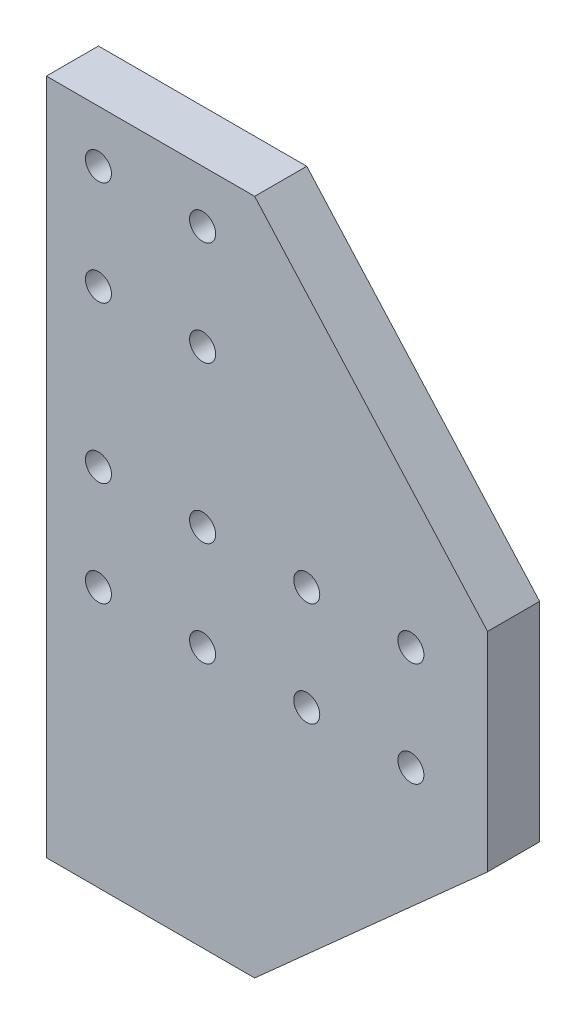
ISO-10303-21;
HEADER;
FILE_DESCRIPTION(('STEP AP214'),'2;1');
FILE_NAME('part.step','',(''),(''),'','','');
FILE_SCHEMA(('AUTOMOTIVE_DESIGN { 1 0 10303 214 1 1 1 1 }'));
ENDSEC;
DATA;
#1=APPLICATION_CONTEXT('core data for automotive mechanical design processes');
#2=APPLICATION_PROTOCOL_DEFINITION('international standard','automotive_design',2000,#1);
#3=PRODUCT_CONTEXT('',#1,'mechanical');
#4=PRODUCT('Part','Part','',(#3));
#5=PRODUCT_RELATED_PRODUCT_CATEGORY('part','',(#4));
#6=PRODUCT_DEFINITION_FORMATION('','',#4);
#7=PRODUCT_DEFINITION_CONTEXT('part definition',#1,'design');
#8=PRODUCT_DEFINITION('design','',#6,#7);
#9=PRODUCT_DEFINITION_SHAPE('','',#8);
#10=(LENGTH_UNIT() NAMED_UNIT(*) SI_UNIT(.MILLI.,.METRE.));
#11=(NAMED_UNIT(*) PLANE_ANGLE_UNIT() SI_UNIT($,.RADIAN.));
#12=(NAMED_UNIT(*) SI_UNIT($,.STERADIAN.) SOLID_ANGLE_UNIT());
#13=UNCERTAINTY_MEASURE_WITH_UNIT(LENGTH_MEASURE(1.E-05),#10,'distance_accuracy_value','');
#14=(GEOMETRIC_REPRESENTATION_CONTEXT(3) GLOBAL_UNCERTAINTY_ASSIGNED_CONTEXT((#13)) GLOBAL_UNIT_ASSIGNED_CONTEXT((#10,
#11,#12)) REPRESENTATION_CONTEXT('',''));
#15=CARTESIAN_POINT('',(0.,0.,0.));
#16=DIRECTION('',(0.,0.,1.));
#17=DIRECTION('',(1.,0.,0.));
#18=AXIS2_PLACEMENT_3D('',#15,#16,#17);
#19=CARTESIAN_POINT('',(0.,130.,10.));
#20=DIRECTION('',(1.,0.,0.));
#21=DIRECTION('',(0.,0.,-1.));
#22=AXIS2_PLACEMENT_3D('',#19,#20,#21);
#23=PLANE('',#22);
#24=DIRECTION('',(0.,-1.,0.));
#25=VECTOR('',#24,1.);
#26=CARTESIAN_POINT('',(0.,130.,0.));
#27=LINE('',#26,#25);
#28=CARTESIAN_POINT('',(0.,130.,0.));
#29=VERTEX_POINT('',#28);
#30=CARTESIAN_POINT('',(0.,0.,0.));
#31=VERTEX_POINT('',#30);
#32=EDGE_CURVE('E132',#29,#31,#27,.T.);
#33=ORIENTED_EDGE('',*,*,#32,.T.);
#34=DIRECTION('',(0.,0.,-1.));
#35=VECTOR('',#34,1.);
#36=CARTESIAN_POINT('',(0.,0.,10.));
#37=LINE('',#36,#35);
#38=CARTESIAN_POINT('',(0.,0.,10.));
#39=VERTEX_POINT('',#38);
#40=EDGE_CURVE('E11',#39,#31,#37,.T.);
#41=ORIENTED_EDGE('',*,*,#40,.F.);
#42=DIRECTION('',(0.,-1.,0.));
#43=VECTOR('',#42,1.);
#44=CARTESIAN_POINT('',(0.,130.,10.));
#45=LINE('',#44,#43);
#46=CARTESIAN_POINT('',(0.,130.,10.));
#47=VERTEX_POINT('',#46);
#48=EDGE_CURVE('E149',#47,#39,#45,.T.);
#49=ORIENTED_EDGE('',*,*,#48,.F.);
#50=DIRECTION('',(0.,0.,-1.));
#51=VECTOR('',#50,1.);
#52=CARTESIAN_POINT('',(0.,130.,10.));
#53=LINE('',#52,#51);
#54=EDGE_CURVE('E128',#47,#29,#53,.T.);
#55=ORIENTED_EDGE('',*,*,#54,.T.);
#56=EDGE_LOOP('',(#33,#41,#49,#55));
#57=FACE_BOUND('',#56,.T.);
#58=ADVANCED_FACE('F43',(#57),#23,.F.);
#59=CARTESIAN_POINT('',(0.,0.,10.));
#60=DIRECTION('',(0.,1.,0.));
#61=DIRECTION('',(0.,0.,1.));
#62=AXIS2_PLACEMENT_3D('',#59,#60,#61);
#63=PLANE('',#62);
#64=DIRECTION('',(1.,0.,0.));
#65=VECTOR('',#64,1.);
#66=CARTESIAN_POINT('',(0.,0.,0.));
#67=LINE('',#66,#65);
#68=CARTESIAN_POINT('',(40.,0.,0.));
#69=VERTEX_POINT('',#68);
#70=EDGE_CURVE('E136',#31,#69,#67,.T.);
#71=ORIENTED_EDGE('',*,*,#70,.T.);
#72=DIRECTION('',(0.,0.,-1.));
#73=VECTOR('',#72,1.);
#74=CARTESIAN_POINT('',(40.,0.,10.));
#75=LINE('',#74,#73);
#76=CARTESIAN_POINT('',(40.,0.,10.));
#77=VERTEX_POINT('',#76);
#78=EDGE_CURVE('E52',#77,#69,#75,.T.);
#79=ORIENTED_EDGE('',*,*,#78,.F.);
#80=DIRECTION('',(1.,0.,0.));
#81=VECTOR('',#80,1.);
#82=CARTESIAN_POINT('',(0.,0.,10.));
#83=LINE('',#82,#81);
#84=EDGE_CURVE('E97',#39,#77,#83,.T.);
#85=ORIENTED_EDGE('',*,*,#84,.F.);
#86=ORIENTED_EDGE('',*,*,#40,.T.);
#87=EDGE_LOOP('',(#71,#79,#85,#86));
#88=FACE_BOUND('',#87,.T.);
#89=ADVANCED_FACE('F178',(#88),#63,.F.);
#90=CARTESIAN_POINT('',(40.,0.,10.));
#91=DIRECTION('',(-0.666666666666667,0.74535599249993,0.));
#92=DIRECTION('',(-0.74535599249993,-0.666666666666667,0.));
#93=AXIS2_PLACEMENT_3D('',#90,#91,#92);
#94=PLANE('',#93);
#95=DIRECTION('',(0.74535599249993,0.666666666666667,0.));
#96=VECTOR('',#95,1.);
#97=CARTESIAN_POINT('',(40.,0.,0.));
#98=LINE('',#97,#96);
#99=CARTESIAN_POINT('',(84.7213595499958,40.,0.));
#100=VERTEX_POINT('',#99);
#101=EDGE_CURVE('E140',#69,#100,#98,.T.);
#102=ORIENTED_EDGE('',*,*,#101,.T.);
#103=DIRECTION('',(0.,0.,-1.));
#104=VECTOR('',#103,1.);
#105=CARTESIAN_POINT('',(84.7213595499958,40.,10.));
#106=LINE('',#105,#104);
#107=CARTESIAN_POINT('',(84.7213595499958,40.,10.));
#108=VERTEX_POINT('',#107);
#109=EDGE_CURVE('E121',#108,#100,#106,.T.);
#110=ORIENTED_EDGE('',*,*,#109,.F.);
#111=DIRECTION('',(0.74535599249993,0.666666666666667,0.));
#112=VECTOR('',#111,1.);
#113=CARTESIAN_POINT('',(40.,0.,10.));
#114=LINE('',#113,#112);
#115=EDGE_CURVE('E110',#77,#108,#114,.T.);
#116=ORIENTED_EDGE('',*,*,#115,.F.);
#117=ORIENTED_EDGE('',*,*,#78,.T.);
#118=EDGE_LOOP('',(#102,#110,#116,#117));
#119=FACE_BOUND('',#118,.T.);
#120=ADVANCED_FACE('F159',(#119),#94,.F.);
#121=CARTESIAN_POINT('',(84.7213595499958,40.,10.));
#122=DIRECTION('',(-1.,0.,0.));
#123=DIRECTION('',(0.,0.,1.));
#124=AXIS2_PLACEMENT_3D('',#121,#122,#123);
#125=PLANE('',#124);
#126=DIRECTION('',(0.,1.,0.));
#127=VECTOR('',#126,1.);
#128=CARTESIAN_POINT('',(84.7213595499958,40.,0.));
#129=LINE('',#128,#127);
#130=CARTESIAN_POINT('',(84.7213595499958,80.,0.));
#131=VERTEX_POINT('',#130);
#132=EDGE_CURVE('E119',#100,#131,#129,.T.);
#133=ORIENTED_EDGE('',*,*,#132,.T.);
#134=DIRECTION('',(0.,0.,-1.));
#135=VECTOR('',#134,1.);
#136=CARTESIAN_POINT('',(84.7213595499958,80.,10.));
#137=LINE('',#136,#135);
#138=CARTESIAN_POINT('',(84.7213595499958,80.,10.));
#139=VERTEX_POINT('',#138);
#140=EDGE_CURVE('E116',#139,#131,#137,.T.);
#141=ORIENTED_EDGE('',*,*,#140,.F.);
#142=DIRECTION('',(0.,1.,0.));
#143=VECTOR('',#142,1.);
#144=CARTESIAN_POINT('',(84.7213595499958,40.,10.));
#145=LINE('',#144,#143);
#146=EDGE_CURVE('E104',#108,#139,#145,.T.);
#147=ORIENTED_EDGE('',*,*,#146,.F.);
#148=ORIENTED_EDGE('',*,*,#109,.T.);
#149=EDGE_LOOP('',(#133,#141,#147,#148));
#150=FACE_BOUND('',#149,.T.);
#151=ADVANCED_FACE('F117',(#150),#125,.F.);
#152=CARTESIAN_POINT('',(84.7213595499958,80.,10.));
#153=DIRECTION('',(-0.74535599249993,-0.666666666666667,0.));
#154=DIRECTION('',(0.666666666666667,-0.74535599249993,0.));
#155=AXIS2_PLACEMENT_3D('',#152,#153,#154);
#156=PLANE('',#155);
#157=DIRECTION('',(-0.666666666666667,0.74535599249993,0.));
#158=VECTOR('',#157,1.);
#159=CARTESIAN_POINT('',(84.7213595499958,80.,0.));
#160=LINE('',#159,#158);
#161=CARTESIAN_POINT('',(40.,130.,0.));
#162=VERTEX_POINT('',#161);
#163=EDGE_CURVE('E83',#131,#162,#160,.T.);
#164=ORIENTED_EDGE('',*,*,#163,.T.);
#165=DIRECTION('',(0.,0.,-1.));
#166=VECTOR('',#165,1.);
#167=CARTESIAN_POINT('',(40.,130.,10.));
#168=LINE('',#167,#166);
#169=CARTESIAN_POINT('',(40.,130.,10.));
#170=VERTEX_POINT('',#169);
#171=EDGE_CURVE('E122',#170,#162,#168,.T.);
#172=ORIENTED_EDGE('',*,*,#171,.F.);
#173=DIRECTION('',(-0.666666666666667,0.74535599249993,0.));
#174=VECTOR('',#173,1.);
#175=CARTESIAN_POINT('',(84.7213595499958,80.,10.));
#176=LINE('',#175,#174);
#177=EDGE_CURVE('E108',#139,#170,#176,.T.);
#178=ORIENTED_EDGE('',*,*,#177,.F.);
#179=ORIENTED_EDGE('',*,*,#140,.T.);
#180=EDGE_LOOP('',(#164,#172,#178,#179));
#181=FACE_BOUND('',#180,.T.);
#182=ADVANCED_FACE('F124',(#181),#156,.F.);
#183=CARTESIAN_POINT('',(40.,130.,10.));
#184=DIRECTION('',(0.,-1.,0.));
#185=DIRECTION('',(0.,0.,-1.));
#186=AXIS2_PLACEMENT_3D('',#183,#184,#185);
#187=PLANE('',#186);
#188=DIRECTION('',(-1.,0.,0.));
#189=VECTOR('',#188,1.);
#190=CARTESIAN_POINT('',(40.,130.,0.));
#191=LINE('',#190,#189);
#192=EDGE_CURVE('E89',#162,#29,#191,.T.);
#193=ORIENTED_EDGE('',*,*,#192,.T.);
#194=ORIENTED_EDGE('',*,*,#54,.F.);
#195=DIRECTION('',(-1.,0.,0.));
#196=VECTOR('',#195,1.);
#197=CARTESIAN_POINT('',(40.,130.,10.));
#198=LINE('',#197,#196);
#199=EDGE_CURVE('E60',#170,#47,#198,.T.);
#200=ORIENTED_EDGE('',*,*,#199,.F.);
#201=ORIENTED_EDGE('',*,*,#171,.T.);
#202=EDGE_LOOP('',(#193,#194,#200,#201));
#203=FACE_BOUND('',#202,.T.);
#204=ADVANCED_FACE('F166',(#203),#187,.F.);
#205=CARTESIAN_POINT('',(0.,0.,10.));
#206=DIRECTION('',(0.,0.,1.));
#207=DIRECTION('',(1.,0.,0.));
#208=AXIS2_PLACEMENT_3D('',#205,#206,#207);
#209=PLANE('',#208);
#210=CARTESIAN_POINT('',(30.,70.,10.));
#211=DIRECTION('',(0.,0.,1.));
#212=DIRECTION('',(1.,0.,0.));
#213=AXIS2_PLACEMENT_3D('',#210,#211,#212);
#214=CIRCLE('',#213,2.50000000000001);
#215=CARTESIAN_POINT('',(32.5,70.,10.));
#216=VERTEX_POINT('',#215);
#217=EDGE_CURVE('E398',#216,#216,#214,.T.);
#218=ORIENTED_EDGE('',*,*,#217,.F.);
#219=EDGE_LOOP('',(#218));
#220=FACE_BOUND('',#219,.T.);
#221=CARTESIAN_POINT('',(10.,50.,10.));
#222=DIRECTION('',(0.,0.,1.));
#223=DIRECTION('',(1.,0.,0.));
#224=AXIS2_PLACEMENT_3D('',#221,#222,#223);
#225=CIRCLE('',#224,2.5);
#226=CARTESIAN_POINT('',(12.5,50.,10.));
#227=VERTEX_POINT('',#226);
#228=EDGE_CURVE('E407',#227,#227,#225,.T.);
#229=ORIENTED_EDGE('',*,*,#228,.F.);
#230=EDGE_LOOP('',(#229));
#231=FACE_BOUND('',#230,.T.);
#232=CARTESIAN_POINT('',(30.,50.,10.));
#233=DIRECTION('',(0.,0.,1.));
#234=DIRECTION('',(1.,0.,0.));
#235=AXIS2_PLACEMENT_3D('',#232,#233,#234);
#236=CIRCLE('',#235,2.50000000000001);
#237=CARTESIAN_POINT('',(32.5,50.,10.));
#238=VERTEX_POINT('',#237);
#239=EDGE_CURVE('E420',#238,#238,#236,.T.);
#240=ORIENTED_EDGE('',*,*,#239,.F.);
#241=EDGE_LOOP('',(#240));
#242=FACE_BOUND('',#241,.T.);
#243=CARTESIAN_POINT('',(50.,70.,10.));
#244=DIRECTION('',(0.,0.,1.));
#245=DIRECTION('',(1.,0.,0.));
#246=AXIS2_PLACEMENT_3D('',#243,#244,#245);
#247=CIRCLE('',#246,2.5);
#248=CARTESIAN_POINT('',(52.5,70.,10.));
#249=VERTEX_POINT('',#248);
#250=EDGE_CURVE('E493',#249,#249,#247,.T.);
#251=ORIENTED_EDGE('',*,*,#250,.F.);
#252=EDGE_LOOP('',(#251));
#253=FACE_BOUND('',#252,.T.);
#254=CARTESIAN_POINT('',(30.,120.,10.));
#255=DIRECTION('',(0.,0.,1.));
#256=DIRECTION('',(1.,0.,0.));
#257=AXIS2_PLACEMENT_3D('',#254,#255,#256);
#258=CIRCLE('',#257,2.50000000000001);
#259=CARTESIAN_POINT('',(32.5,120.,10.));
#260=VERTEX_POINT('',#259);
#261=EDGE_CURVE('E433',#260,#260,#258,.T.);
#262=ORIENTED_EDGE('',*,*,#261,.F.);
#263=EDGE_LOOP('',(#262));
#264=FACE_BOUND('',#263,.T.);
#265=CARTESIAN_POINT('',(10.,100.,10.));
#266=DIRECTION('',(0.,0.,1.));
#267=DIRECTION('',(1.,0.,0.));
#268=AXIS2_PLACEMENT_3D('',#265,#266,#267);
#269=CIRCLE('',#268,2.5);
#270=CARTESIAN_POINT('',(12.5,100.,10.));
#271=VERTEX_POINT('',#270);
#272=EDGE_CURVE('E442',#271,#271,#269,.T.);
#273=ORIENTED_EDGE('',*,*,#272,.F.);
#274=EDGE_LOOP('',(#273));
#275=FACE_BOUND('',#274,.T.);
#276=CARTESIAN_POINT('',(30.,100.,10.));
#277=DIRECTION('',(0.,0.,1.));
#278=DIRECTION('',(1.,0.,0.));
#279=AXIS2_PLACEMENT_3D('',#276,#277,#278);
#280=CIRCLE('',#279,2.50000000000001);
#281=CARTESIAN_POINT('',(32.5,100.,10.));
#282=VERTEX_POINT('',#281);
#283=EDGE_CURVE('E421',#282,#282,#280,.T.);
#284=ORIENTED_EDGE('',*,*,#283,.F.);
#285=EDGE_LOOP('',(#284));
#286=FACE_BOUND('',#285,.T.);
#287=CARTESIAN_POINT('',(10.,70.,10.));
#288=DIRECTION('',(0.,0.,1.));
#289=DIRECTION('',(1.,0.,0.));
#290=AXIS2_PLACEMENT_3D('',#287,#288,#289);
#291=CIRCLE('',#290,2.5);
#292=CARTESIAN_POINT('',(12.5,70.,10.));
#293=VERTEX_POINT('',#292);
#294=EDGE_CURVE('E405',#293,#293,#291,.T.);
#295=ORIENTED_EDGE('',*,*,#294,.F.);
#296=EDGE_LOOP('',(#295));
#297=FACE_BOUND('',#296,.T.);
#298=CARTESIAN_POINT('',(70.,50.,10.));
#299=DIRECTION('',(0.,0.,1.));
#300=DIRECTION('',(1.,0.,0.));
#301=AXIS2_PLACEMENT_3D('',#298,#299,#300);
#302=CIRCLE('',#301,2.5);
#303=CARTESIAN_POINT('',(72.5,50.,10.));
#304=VERTEX_POINT('',#303);
#305=EDGE_CURVE('E478',#304,#304,#302,.T.);
#306=ORIENTED_EDGE('',*,*,#305,.F.);
#307=EDGE_LOOP('',(#306));
#308=FACE_BOUND('',#307,.T.);
#309=CARTESIAN_POINT('',(50.,50.,10.));
#310=DIRECTION('',(0.,0.,1.));
#311=DIRECTION('',(1.,0.,0.));
#312=AXIS2_PLACEMENT_3D('',#309,#310,#311);
#313=CIRCLE('',#312,2.5);
#314=CARTESIAN_POINT('',(52.5,50.,10.));
#315=VERTEX_POINT('',#314);
#316=EDGE_CURVE('E482',#315,#315,#313,.T.);
#317=ORIENTED_EDGE('',*,*,#316,.F.);
#318=EDGE_LOOP('',(#317));
#319=FACE_BOUND('',#318,.T.);
#320=CARTESIAN_POINT('',(70.,70.,10.));
#321=DIRECTION('',(0.,0.,1.));
#322=DIRECTION('',(1.,0.,0.));
#323=AXIS2_PLACEMENT_3D('',#320,#321,#322);
#324=CIRCLE('',#323,2.5);
#325=CARTESIAN_POINT('',(72.5,70.,10.));
#326=VERTEX_POINT('',#325);
#327=EDGE_CURVE('E485',#326,#326,#324,.T.);
#328=ORIENTED_EDGE('',*,*,#327,.F.);
#329=EDGE_LOOP('',(#328));
#330=FACE_BOUND('',#329,.T.);
#331=CARTESIAN_POINT('',(10.,120.,10.));
#332=DIRECTION('',(0.,0.,1.));
#333=DIRECTION('',(1.,0.,0.));
#334=AXIS2_PLACEMENT_3D('',#331,#332,#333);
#335=CIRCLE('',#334,2.5);
#336=CARTESIAN_POINT('',(12.5,120.,10.));
#337=VERTEX_POINT('',#336);
#338=EDGE_CURVE('E437',#337,#337,#335,.T.);
#339=ORIENTED_EDGE('',*,*,#338,.F.);
#340=EDGE_LOOP('',(#339));
#341=FACE_BOUND('',#340,.T.);
#342=ORIENTED_EDGE('',*,*,#48,.T.);
#343=ORIENTED_EDGE('',*,*,#84,.T.);
#344=ORIENTED_EDGE('',*,*,#115,.T.);
#345=ORIENTED_EDGE('',*,*,#146,.T.);
#346=ORIENTED_EDGE('',*,*,#177,.T.);
#347=ORIENTED_EDGE('',*,*,#199,.T.);
#348=EDGE_LOOP('',(#342,#343,#344,#345,#346,#347));
#349=FACE_BOUND('',#348,.T.);
#350=ADVANCED_FACE('F106',(#220,#231,#242,#253,#264,#275,#286,#297,#308,#319,#330,#341,#349),
#209,.T.);
#351=CARTESIAN_POINT('',(0.,0.,0.));
#352=DIRECTION('',(0.,0.,1.));
#353=DIRECTION('',(1.,0.,0.));
#354=AXIS2_PLACEMENT_3D('',#351,#352,#353);
#355=PLANE('',#354);
#356=CARTESIAN_POINT('',(30.,70.,0.));
#357=DIRECTION('',(0.,0.,1.));
#358=DIRECTION('',(1.,0.,0.));
#359=AXIS2_PLACEMENT_3D('',#356,#357,#358);
#360=CIRCLE('',#359,2.50000000000001);
#361=CARTESIAN_POINT('',(32.5,70.,0.));
#362=VERTEX_POINT('',#361);
#363=EDGE_CURVE('E395',#362,#362,#360,.T.);
#364=ORIENTED_EDGE('',*,*,#363,.T.);
#365=EDGE_LOOP('',(#364));
#366=FACE_BOUND('',#365,.T.);
#367=CARTESIAN_POINT('',(10.,50.,0.));
#368=DIRECTION('',(0.,0.,1.));
#369=DIRECTION('',(1.,0.,0.));
#370=AXIS2_PLACEMENT_3D('',#367,#368,#369);
#371=CIRCLE('',#370,2.5);
#372=CARTESIAN_POINT('',(12.5,50.,0.));
#373=VERTEX_POINT('',#372);
#374=EDGE_CURVE('E416',#373,#373,#371,.T.);
#375=ORIENTED_EDGE('',*,*,#374,.T.);
#376=EDGE_LOOP('',(#375));
#377=FACE_BOUND('',#376,.T.);
#378=CARTESIAN_POINT('',(30.,50.,0.));
#379=DIRECTION('',(0.,0.,1.));
#380=DIRECTION('',(1.,0.,0.));
#381=AXIS2_PLACEMENT_3D('',#378,#379,#380);
#382=CIRCLE('',#381,2.50000000000001);
#383=CARTESIAN_POINT('',(32.5,50.,0.));
#384=VERTEX_POINT('',#383);
#385=EDGE_CURVE('E509',#384,#384,#382,.T.);
#386=ORIENTED_EDGE('',*,*,#385,.T.);
#387=EDGE_LOOP('',(#386));
#388=FACE_BOUND('',#387,.T.);
#389=CARTESIAN_POINT('',(50.,70.,0.));
#390=DIRECTION('',(0.,0.,1.));
#391=DIRECTION('',(1.,0.,0.));
#392=AXIS2_PLACEMENT_3D('',#389,#390,#391);
#393=CIRCLE('',#392,2.5);
#394=CARTESIAN_POINT('',(52.5,70.,0.));
#395=VERTEX_POINT('',#394);
#396=EDGE_CURVE('E410',#395,#395,#393,.T.);
#397=ORIENTED_EDGE('',*,*,#396,.T.);
#398=EDGE_LOOP('',(#397));
#399=FACE_BOUND('',#398,.T.);
#400=CARTESIAN_POINT('',(30.,120.,0.));
#401=DIRECTION('',(0.,0.,1.));
#402=DIRECTION('',(1.,0.,0.));
#403=AXIS2_PLACEMENT_3D('',#400,#401,#402);
#404=CIRCLE('',#403,2.50000000000001);
#405=CARTESIAN_POINT('',(32.5,120.,0.));
#406=VERTEX_POINT('',#405);
#407=EDGE_CURVE('E438',#406,#406,#404,.T.);
#408=ORIENTED_EDGE('',*,*,#407,.T.);
#409=EDGE_LOOP('',(#408));
#410=FACE_BOUND('',#409,.T.);
#411=CARTESIAN_POINT('',(10.,100.,0.));
#412=DIRECTION('',(0.,0.,1.));
#413=DIRECTION('',(1.,0.,0.));
#414=AXIS2_PLACEMENT_3D('',#411,#412,#413);
#415=CIRCLE('',#414,2.5);
#416=CARTESIAN_POINT('',(12.5,100.,0.));
#417=VERTEX_POINT('',#416);
#418=EDGE_CURVE('E425',#417,#417,#415,.T.);
#419=ORIENTED_EDGE('',*,*,#418,.T.);
#420=EDGE_LOOP('',(#419));
#421=FACE_BOUND('',#420,.T.);
#422=CARTESIAN_POINT('',(30.,100.,0.));
#423=DIRECTION('',(0.,0.,1.));
#424=DIRECTION('',(1.,0.,0.));
#425=AXIS2_PLACEMENT_3D('',#422,#423,#424);
#426=CIRCLE('',#425,2.50000000000001);
#427=CARTESIAN_POINT('',(32.5,100.,0.));
#428=VERTEX_POINT('',#427);
#429=EDGE_CURVE('E426',#428,#428,#426,.T.);
#430=ORIENTED_EDGE('',*,*,#429,.T.);
#431=EDGE_LOOP('',(#430));
#432=FACE_BOUND('',#431,.T.);
#433=CARTESIAN_POINT('',(10.,70.,0.));
#434=DIRECTION('',(0.,0.,1.));
#435=DIRECTION('',(1.,0.,0.));
#436=AXIS2_PLACEMENT_3D('',#433,#434,#435);
#437=CIRCLE('',#436,2.5);
#438=CARTESIAN_POINT('',(12.5,70.,0.));
#439=VERTEX_POINT('',#438);
#440=EDGE_CURVE('E400',#439,#439,#437,.T.);
#441=ORIENTED_EDGE('',*,*,#440,.T.);
#442=EDGE_LOOP('',(#441));
#443=FACE_BOUND('',#442,.T.);
#444=CARTESIAN_POINT('',(70.,50.,0.));
#445=DIRECTION('',(0.,0.,1.));
#446=DIRECTION('',(1.,0.,0.));
#447=AXIS2_PLACEMENT_3D('',#444,#445,#446);
#448=CIRCLE('',#447,2.5);
#449=CARTESIAN_POINT('',(72.5,50.,0.));
#450=VERTEX_POINT('',#449);
#451=EDGE_CURVE('E497',#450,#450,#448,.T.);
#452=ORIENTED_EDGE('',*,*,#451,.T.);
#453=EDGE_LOOP('',(#452));
#454=FACE_BOUND('',#453,.T.);
#455=CARTESIAN_POINT('',(50.,50.,0.));
#456=DIRECTION('',(0.,0.,1.));
#457=DIRECTION('',(1.,0.,0.));
#458=AXIS2_PLACEMENT_3D('',#455,#456,#457);
#459=CIRCLE('',#458,2.5);
#460=CARTESIAN_POINT('',(52.5,50.,0.));
#461=VERTEX_POINT('',#460);
#462=EDGE_CURVE('E502',#461,#461,#459,.T.);
#463=ORIENTED_EDGE('',*,*,#462,.T.);
#464=EDGE_LOOP('',(#463));
#465=FACE_BOUND('',#464,.T.);
#466=CARTESIAN_POINT('',(70.,70.,0.));
#467=DIRECTION('',(0.,0.,1.));
#468=DIRECTION('',(1.,0.,0.));
#469=AXIS2_PLACEMENT_3D('',#466,#467,#468);
#470=CIRCLE('',#469,2.5);
#471=CARTESIAN_POINT('',(72.5,70.,0.));
#472=VERTEX_POINT('',#471);
#473=EDGE_CURVE('E488',#472,#472,#470,.T.);
#474=ORIENTED_EDGE('',*,*,#473,.T.);
#475=EDGE_LOOP('',(#474));
#476=FACE_BOUND('',#475,.T.);
#477=CARTESIAN_POINT('',(10.,120.,0.));
#478=DIRECTION('',(0.,0.,1.));
#479=DIRECTION('',(1.,0.,0.));
#480=AXIS2_PLACEMENT_3D('',#477,#478,#479);
#481=CIRCLE('',#480,2.5);
#482=CARTESIAN_POINT('',(12.5,120.,0.));
#483=VERTEX_POINT('',#482);
#484=EDGE_CURVE('E137',#483,#483,#481,.T.);
#485=ORIENTED_EDGE('',*,*,#484,.T.);
#486=EDGE_LOOP('',(#485));
#487=FACE_BOUND('',#486,.T.);
#488=ORIENTED_EDGE('',*,*,#32,.F.);
#489=ORIENTED_EDGE('',*,*,#192,.F.);
#490=ORIENTED_EDGE('',*,*,#163,.F.);
#491=ORIENTED_EDGE('',*,*,#132,.F.);
#492=ORIENTED_EDGE('',*,*,#101,.F.);
#493=ORIENTED_EDGE('',*,*,#70,.F.);
#494=EDGE_LOOP('',(#488,#489,#490,#491,#492,#493));
#495=FACE_BOUND('',#494,.T.);
#496=ADVANCED_FACE('F162',(#366,#377,#388,#399,#410,#421,#432,#443,#454,#465,#476,#487,#495),
#355,.F.);
#497=CARTESIAN_POINT('',(10.,120.,0.));
#498=DIRECTION('',(0.,0.,1.));
#499=DIRECTION('',(1.,0.,0.));
#500=AXIS2_PLACEMENT_3D('',#497,#498,#499);
#501=CYLINDRICAL_SURFACE('',#500,2.5);
#502=ORIENTED_EDGE('',*,*,#484,.F.);
#503=EDGE_LOOP('',(#502));
#504=FACE_BOUND('',#503,.T.);
#505=ORIENTED_EDGE('',*,*,#338,.T.);
#506=EDGE_LOOP('',(#505));
#507=FACE_BOUND('',#506,.T.);
#508=ADVANCED_FACE('F218',(#504,#507),#501,.F.);
#509=CARTESIAN_POINT('',(70.,70.,0.));
#510=DIRECTION('',(0.,0.,1.));
#511=DIRECTION('',(1.,0.,0.));
#512=AXIS2_PLACEMENT_3D('',#509,#510,#511);
#513=CYLINDRICAL_SURFACE('',#512,2.5);
#514=ORIENTED_EDGE('',*,*,#473,.F.);
#515=EDGE_LOOP('',(#514));
#516=FACE_BOUND('',#515,.T.);
#517=ORIENTED_EDGE('',*,*,#327,.T.);
#518=EDGE_LOOP('',(#517));
#519=FACE_BOUND('',#518,.T.);
#520=ADVANCED_FACE('F228',(#516,#519),#513,.F.);
#521=CARTESIAN_POINT('',(50.,50.,0.));
#522=DIRECTION('',(0.,0.,1.));
#523=DIRECTION('',(1.,0.,0.));
#524=AXIS2_PLACEMENT_3D('',#521,#522,#523);
#525=CYLINDRICAL_SURFACE('',#524,2.5);
#526=ORIENTED_EDGE('',*,*,#462,.F.);
#527=EDGE_LOOP('',(#526));
#528=FACE_BOUND('',#527,.T.);
#529=ORIENTED_EDGE('',*,*,#316,.T.);
#530=EDGE_LOOP('',(#529));
#531=FACE_BOUND('',#530,.T.);
#532=ADVANCED_FACE('F239',(#528,#531),#525,.F.);
#533=CARTESIAN_POINT('',(70.,50.,0.));
#534=DIRECTION('',(0.,0.,1.));
#535=DIRECTION('',(1.,0.,0.));
#536=AXIS2_PLACEMENT_3D('',#533,#534,#535);
#537=CYLINDRICAL_SURFACE('',#536,2.5);
#538=ORIENTED_EDGE('',*,*,#451,.F.);
#539=EDGE_LOOP('',(#538));
#540=FACE_BOUND('',#539,.T.);
#541=ORIENTED_EDGE('',*,*,#305,.T.);
#542=EDGE_LOOP('',(#541));
#543=FACE_BOUND('',#542,.T.);
#544=ADVANCED_FACE('F250',(#540,#543),#537,.F.);
#545=CARTESIAN_POINT('',(10.,70.,0.));
#546=DIRECTION('',(0.,0.,1.));
#547=DIRECTION('',(1.,0.,0.));
#548=AXIS2_PLACEMENT_3D('',#545,#546,#547);
#549=CYLINDRICAL_SURFACE('',#548,2.5);
#550=ORIENTED_EDGE('',*,*,#440,.F.);
#551=EDGE_LOOP('',(#550));
#552=FACE_BOUND('',#551,.T.);
#553=ORIENTED_EDGE('',*,*,#294,.T.);
#554=EDGE_LOOP('',(#553));
#555=FACE_BOUND('',#554,.T.);
#556=ADVANCED_FACE('F261',(#552,#555),#549,.F.);
#557=CARTESIAN_POINT('',(30.,100.,0.));
#558=DIRECTION('',(0.,0.,1.));
#559=DIRECTION('',(1.,0.,0.));
#560=AXIS2_PLACEMENT_3D('',#557,#558,#559);
#561=CYLINDRICAL_SURFACE('',#560,2.50000000000001);
#562=ORIENTED_EDGE('',*,*,#429,.F.);
#563=EDGE_LOOP('',(#562));
#564=FACE_BOUND('',#563,.T.);
#565=ORIENTED_EDGE('',*,*,#283,.T.);
#566=EDGE_LOOP('',(#565));
#567=FACE_BOUND('',#566,.T.);
#568=ADVANCED_FACE('F272',(#564,#567),#561,.F.);
#569=CARTESIAN_POINT('',(10.,100.,0.));
#570=DIRECTION('',(0.,0.,1.));
#571=DIRECTION('',(1.,0.,0.));
#572=AXIS2_PLACEMENT_3D('',#569,#570,#571);
#573=CYLINDRICAL_SURFACE('',#572,2.5);
#574=ORIENTED_EDGE('',*,*,#418,.F.);
#575=EDGE_LOOP('',(#574));
#576=FACE_BOUND('',#575,.T.);
#577=ORIENTED_EDGE('',*,*,#272,.T.);
#578=EDGE_LOOP('',(#577));
#579=FACE_BOUND('',#578,.T.);
#580=ADVANCED_FACE('F283',(#576,#579),#573,.F.);
#581=CARTESIAN_POINT('',(30.,120.,0.));
#582=DIRECTION('',(0.,0.,1.));
#583=DIRECTION('',(1.,0.,0.));
#584=AXIS2_PLACEMENT_3D('',#581,#582,#583);
#585=CYLINDRICAL_SURFACE('',#584,2.50000000000001);
#586=ORIENTED_EDGE('',*,*,#407,.F.);
#587=EDGE_LOOP('',(#586));
#588=FACE_BOUND('',#587,.T.);
#589=ORIENTED_EDGE('',*,*,#261,.T.);
#590=EDGE_LOOP('',(#589));
#591=FACE_BOUND('',#590,.T.);
#592=ADVANCED_FACE('F294',(#588,#591),#585,.F.);
#593=CARTESIAN_POINT('',(50.,70.,0.));
#594=DIRECTION('',(0.,0.,1.));
#595=DIRECTION('',(1.,0.,0.));
#596=AXIS2_PLACEMENT_3D('',#593,#594,#595);
#597=CYLINDRICAL_SURFACE('',#596,2.5);
#598=ORIENTED_EDGE('',*,*,#396,.F.);
#599=EDGE_LOOP('',(#598));
#600=FACE_BOUND('',#599,.T.);
#601=ORIENTED_EDGE('',*,*,#250,.T.);
#602=EDGE_LOOP('',(#601));
#603=FACE_BOUND('',#602,.T.);
#604=ADVANCED_FACE('F305',(#600,#603),#597,.F.);
#605=CARTESIAN_POINT('',(30.,50.,0.));
#606=DIRECTION('',(0.,0.,1.));
#607=DIRECTION('',(1.,0.,0.));
#608=AXIS2_PLACEMENT_3D('',#605,#606,#607);
#609=CYLINDRICAL_SURFACE('',#608,2.50000000000001);
#610=ORIENTED_EDGE('',*,*,#385,.F.);
#611=EDGE_LOOP('',(#610));
#612=FACE_BOUND('',#611,.T.);
#613=ORIENTED_EDGE('',*,*,#239,.T.);
#614=EDGE_LOOP('',(#613));
#615=FACE_BOUND('',#614,.T.);
#616=ADVANCED_FACE('F316',(#612,#615),#609,.F.);
#617=CARTESIAN_POINT('',(10.,50.,0.));
#618=DIRECTION('',(0.,0.,1.));
#619=DIRECTION('',(1.,0.,0.));
#620=AXIS2_PLACEMENT_3D('',#617,#618,#619);
#621=CYLINDRICAL_SURFACE('',#620,2.5);
#622=ORIENTED_EDGE('',*,*,#374,.F.);
#623=EDGE_LOOP('',(#622));
#624=FACE_BOUND('',#623,.T.);
#625=ORIENTED_EDGE('',*,*,#228,.T.);
#626=EDGE_LOOP('',(#625));
#627=FACE_BOUND('',#626,.T.);
#628=ADVANCED_FACE('F327',(#624,#627),#621,.F.);
#629=CARTESIAN_POINT('',(30.,70.,0.));
#630=DIRECTION('',(0.,0.,1.));
#631=DIRECTION('',(1.,0.,0.));
#632=AXIS2_PLACEMENT_3D('',#629,#630,#631);
#633=CYLINDRICAL_SURFACE('',#632,2.50000000000001);
#634=ORIENTED_EDGE('',*,*,#363,.F.);
#635=EDGE_LOOP('',(#634));
#636=FACE_BOUND('',#635,.T.);
#637=ORIENTED_EDGE('',*,*,#217,.T.);
#638=EDGE_LOOP('',(#637));
#639=FACE_BOUND('',#638,.T.);
#640=ADVANCED_FACE('F338',(#636,#639),#633,.F.);
#641=CLOSED_SHELL('',(#58,#89,#120,#151,#182,#204,#350,#496,#508,#520,#532,#544,#556,#568,#580,
#592,#604,#616,#628,#640));
#642=MANIFOLD_SOLID_BREP('B2',#641);
#643=ADVANCED_BREP_SHAPE_REPRESENTATION('',(#18,#642),#14);
#644=SHAPE_DEFINITION_REPRESENTATION(#9,#643);
ENDSEC;
END-ISO-10303-21;
